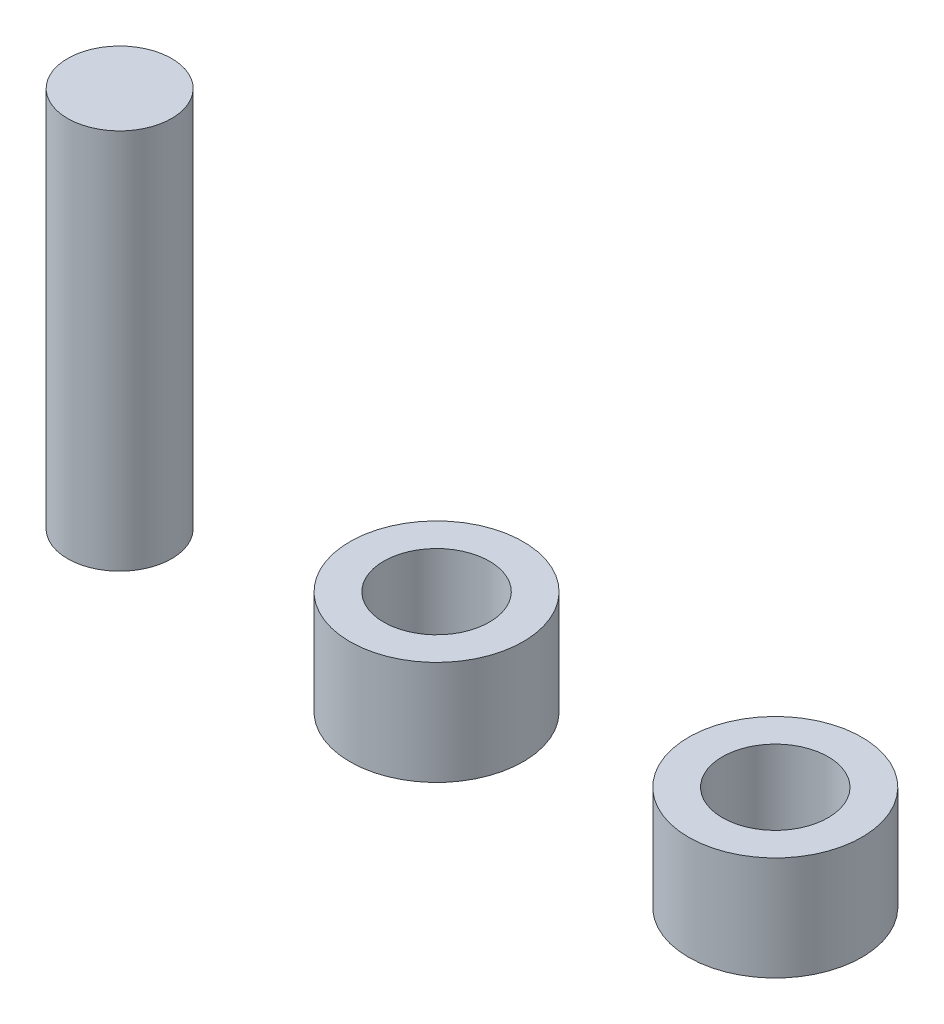
ISO-10303-21;
HEADER;
FILE_DESCRIPTION(('STEP AP214'),'2;1');
FILE_NAME('part.step','',(''),(''),'','','');
FILE_SCHEMA(('AUTOMOTIVE_DESIGN { 1 0 10303 214 1 1 1 1 }'));
ENDSEC;
DATA;
#1=APPLICATION_CONTEXT('core data for automotive mechanical design processes');
#2=APPLICATION_PROTOCOL_DEFINITION('international standard','automotive_design',2000,#1);
#3=PRODUCT_CONTEXT('',#1,'mechanical');
#4=PRODUCT('Part','Part','',(#3));
#5=PRODUCT_RELATED_PRODUCT_CATEGORY('part','',(#4));
#6=PRODUCT_DEFINITION_FORMATION('','',#4);
#7=PRODUCT_DEFINITION_CONTEXT('part definition',#1,'design');
#8=PRODUCT_DEFINITION('design','',#6,#7);
#9=PRODUCT_DEFINITION_SHAPE('','',#8);
#10=(LENGTH_UNIT() NAMED_UNIT(*) SI_UNIT(.MILLI.,.METRE.));
#11=(NAMED_UNIT(*) PLANE_ANGLE_UNIT() SI_UNIT($,.RADIAN.));
#12=(NAMED_UNIT(*) SI_UNIT($,.STERADIAN.) SOLID_ANGLE_UNIT());
#13=UNCERTAINTY_MEASURE_WITH_UNIT(LENGTH_MEASURE(1.E-05),#10,'distance_accuracy_value','');
#14=(GEOMETRIC_REPRESENTATION_CONTEXT(3) GLOBAL_UNCERTAINTY_ASSIGNED_CONTEXT((#13)) GLOBAL_UNIT_ASSIGNED_CONTEXT((#10,
#11,#12)) REPRESENTATION_CONTEXT('',''));
#15=CARTESIAN_POINT('',(0.,0.,0.));
#16=DIRECTION('',(0.,0.,1.));
#17=DIRECTION('',(1.,0.,0.));
#18=AXIS2_PLACEMENT_3D('',#15,#16,#17);
#19=CARTESIAN_POINT('',(9.88541352372916,3.,0.));
#20=DIRECTION('',(0.,1.,0.));
#21=DIRECTION('',(0.,0.,1.));
#22=AXIS2_PLACEMENT_3D('',#19,#20,#21);
#23=PLANE('',#22);
#24=CARTESIAN_POINT('',(9.88541352372916,3.,0.));
#25=DIRECTION('',(0.,-1.,0.));
#26=DIRECTION('',(0.,0.,1.));
#27=AXIS2_PLACEMENT_3D('',#24,#25,#26);
#28=CIRCLE('',#27,2.5);
#29=CARTESIAN_POINT('',(9.88541352372916,3.,2.5));
#30=VERTEX_POINT('',#29);
#31=EDGE_CURVE('E11',#30,#30,#28,.T.);
#32=ORIENTED_EDGE('',*,*,#31,.F.);
#33=EDGE_LOOP('',(#32));
#34=FACE_BOUND('',#33,.T.);
#35=CARTESIAN_POINT('',(9.88541352372916,3.,0.));
#36=DIRECTION('',(0.,-1.,0.));
#37=DIRECTION('',(0.,0.,1.));
#38=AXIS2_PLACEMENT_3D('',#35,#36,#37);
#39=CIRCLE('',#38,1.525);
#40=CARTESIAN_POINT('',(9.88541352372916,3.,1.525));
#41=VERTEX_POINT('',#40);
#42=EDGE_CURVE('E51',#41,#41,#39,.T.);
#43=ORIENTED_EDGE('',*,*,#42,.T.);
#44=EDGE_LOOP('',(#43));
#45=FACE_BOUND('',#44,.T.);
#46=ADVANCED_FACE('F40',(#34,#45),#23,.T.);
#47=CARTESIAN_POINT('',(9.88541352372916,0.,0.));
#48=DIRECTION('',(0.,1.,0.));
#49=DIRECTION('',(0.,0.,1.));
#50=AXIS2_PLACEMENT_3D('',#47,#48,#49);
#51=PLANE('',#50);
#52=CARTESIAN_POINT('',(9.88541352372916,0.,0.));
#53=DIRECTION('',(0.,-1.,0.));
#54=DIRECTION('',(0.,0.,1.));
#55=AXIS2_PLACEMENT_3D('',#52,#53,#54);
#56=CIRCLE('',#55,2.5);
#57=CARTESIAN_POINT('',(9.88541352372916,0.,2.5));
#58=VERTEX_POINT('',#57);
#59=EDGE_CURVE('E44',#58,#58,#56,.T.);
#60=ORIENTED_EDGE('',*,*,#59,.T.);
#61=EDGE_LOOP('',(#60));
#62=FACE_BOUND('',#61,.T.);
#63=CARTESIAN_POINT('',(9.88541352372916,0.,0.));
#64=DIRECTION('',(0.,-1.,0.));
#65=DIRECTION('',(0.,0.,1.));
#66=AXIS2_PLACEMENT_3D('',#63,#64,#65);
#67=CIRCLE('',#66,1.525);
#68=CARTESIAN_POINT('',(9.88541352372916,0.,1.525));
#69=VERTEX_POINT('',#68);
#70=EDGE_CURVE('E53',#69,#69,#67,.T.);
#71=ORIENTED_EDGE('',*,*,#70,.F.);
#72=EDGE_LOOP('',(#71));
#73=FACE_BOUND('',#72,.T.);
#74=ADVANCED_FACE('F66',(#62,#73),#51,.F.);
#75=CARTESIAN_POINT('',(9.88541352372916,3.,0.));
#76=DIRECTION('',(0.,-1.,0.));
#77=DIRECTION('',(0.,0.,-1.));
#78=AXIS2_PLACEMENT_3D('',#75,#76,#77);
#79=CYLINDRICAL_SURFACE('',#78,2.5);
#80=ORIENTED_EDGE('',*,*,#31,.T.);
#81=EDGE_LOOP('',(#80));
#82=FACE_BOUND('',#81,.T.);
#83=ORIENTED_EDGE('',*,*,#59,.F.);
#84=EDGE_LOOP('',(#83));
#85=FACE_BOUND('',#84,.T.);
#86=ADVANCED_FACE('F42',(#82,#85),#79,.T.);
#87=CARTESIAN_POINT('',(9.88541352372916,3.,0.));
#88=DIRECTION('',(0.,-1.,0.));
#89=DIRECTION('',(0.,0.,-1.));
#90=AXIS2_PLACEMENT_3D('',#87,#88,#89);
#91=CYLINDRICAL_SURFACE('',#90,1.525);
#92=ORIENTED_EDGE('',*,*,#42,.F.);
#93=EDGE_LOOP('',(#92));
#94=FACE_BOUND('',#93,.T.);
#95=ORIENTED_EDGE('',*,*,#70,.T.);
#96=EDGE_LOOP('',(#95));
#97=FACE_BOUND('',#96,.T.);
#98=ADVANCED_FACE('F60',(#94,#97),#91,.F.);
#99=CLOSED_SHELL('',(#46,#74,#86,#98));
#100=MANIFOLD_SOLID_BREP('B2',#99);
#101=CARTESIAN_POINT('',(-9.0272965862901,11.,0.));
#102=DIRECTION('',(0.,-1.,0.));
#103=DIRECTION('',(0.,0.,-1.));
#104=AXIS2_PLACEMENT_3D('',#101,#102,#103);
#105=CYLINDRICAL_SURFACE('',#104,1.5);
#106=CARTESIAN_POINT('',(-9.0272965862901,11.,0.));
#107=DIRECTION('',(0.,1.,0.));
#108=DIRECTION('',(0.,0.,1.));
#109=AXIS2_PLACEMENT_3D('',#106,#107,#108);
#110=CIRCLE('',#109,1.5);
#111=CARTESIAN_POINT('',(-9.0272965862901,11.,1.5));
#112=VERTEX_POINT('',#111);
#113=EDGE_CURVE('E39',#112,#112,#110,.T.);
#114=ORIENTED_EDGE('',*,*,#113,.F.);
#115=EDGE_LOOP('',(#114));
#116=FACE_BOUND('',#115,.T.);
#117=CARTESIAN_POINT('',(-9.0272965862901,0.,0.));
#118=DIRECTION('',(0.,1.,0.));
#119=DIRECTION('',(0.,0.,1.));
#120=AXIS2_PLACEMENT_3D('',#117,#118,#119);
#121=CIRCLE('',#120,1.5);
#122=CARTESIAN_POINT('',(-9.0272965862901,0.,1.5));
#123=VERTEX_POINT('',#122);
#124=EDGE_CURVE('E112',#123,#123,#121,.T.);
#125=ORIENTED_EDGE('',*,*,#124,.T.);
#126=EDGE_LOOP('',(#125));
#127=FACE_BOUND('',#126,.T.);
#128=ADVANCED_FACE('F109',(#116,#127),#105,.T.);
#129=CARTESIAN_POINT('',(-9.0272965862901,11.,0.));
#130=DIRECTION('',(0.,1.,0.));
#131=DIRECTION('',(0.,0.,1.));
#132=AXIS2_PLACEMENT_3D('',#129,#130,#131);
#133=PLANE('',#132);
#134=ORIENTED_EDGE('',*,*,#113,.T.);
#135=EDGE_LOOP('',(#134));
#136=FACE_BOUND('',#135,.T.);
#137=ADVANCED_FACE('F124',(#136),#133,.T.);
#138=CARTESIAN_POINT('',(-9.0272965862901,0.,0.));
#139=DIRECTION('',(0.,1.,0.));
#140=DIRECTION('',(0.,0.,1.));
#141=AXIS2_PLACEMENT_3D('',#138,#139,#140);
#142=PLANE('',#141);
#143=ORIENTED_EDGE('',*,*,#124,.F.);
#144=EDGE_LOOP('',(#143));
#145=FACE_BOUND('',#144,.T.);
#146=ADVANCED_FACE('F122',(#145),#142,.F.);
#147=CLOSED_SHELL('',(#128,#137,#146));
#148=MANIFOLD_SOLID_BREP('B6',#147);
#149=CARTESIAN_POINT('',(0.11458647627084,3.,0.));
#150=DIRECTION('',(0.,1.,0.));
#151=DIRECTION('',(0.,0.,1.));
#152=AXIS2_PLACEMENT_3D('',#149,#150,#151);
#153=PLANE('',#152);
#154=CARTESIAN_POINT('',(0.11458647627084,3.,0.));
#155=DIRECTION('',(0.,1.,0.));
#156=DIRECTION('',(0.,0.,1.));
#157=AXIS2_PLACEMENT_3D('',#154,#155,#156);
#158=CIRCLE('',#157,2.5);
#159=CARTESIAN_POINT('',(0.11458647627084,3.,2.5));
#160=VERTEX_POINT('',#159);
#161=EDGE_CURVE('E108',#160,#160,#158,.T.);
#162=ORIENTED_EDGE('',*,*,#161,.T.);
#163=EDGE_LOOP('',(#162));
#164=FACE_BOUND('',#163,.T.);
#165=CARTESIAN_POINT('',(0.11458647627084,3.,0.));
#166=DIRECTION('',(0.,1.,0.));
#167=DIRECTION('',(0.,0.,1.));
#168=AXIS2_PLACEMENT_3D('',#165,#166,#167);
#169=CIRCLE('',#168,1.525);
#170=CARTESIAN_POINT('',(0.11458647627084,3.,1.525));
#171=VERTEX_POINT('',#170);
#172=EDGE_CURVE('E161',#171,#171,#169,.T.);
#173=ORIENTED_EDGE('',*,*,#172,.F.);
#174=EDGE_LOOP('',(#173));
#175=FACE_BOUND('',#174,.T.);
#176=ADVANCED_FACE('F150',(#164,#175),#153,.T.);
#177=CARTESIAN_POINT('',(0.11458647627084,0.,0.));
#178=DIRECTION('',(0.,1.,0.));
#179=DIRECTION('',(0.,0.,1.));
#180=AXIS2_PLACEMENT_3D('',#177,#178,#179);
#181=PLANE('',#180);
#182=CARTESIAN_POINT('',(0.11458647627084,0.,0.));
#183=DIRECTION('',(0.,1.,0.));
#184=DIRECTION('',(0.,0.,1.));
#185=AXIS2_PLACEMENT_3D('',#182,#183,#184);
#186=CIRCLE('',#185,2.5);
#187=CARTESIAN_POINT('',(0.11458647627084,0.,2.5));
#188=VERTEX_POINT('',#187);
#189=EDGE_CURVE('E154',#188,#188,#186,.T.);
#190=ORIENTED_EDGE('',*,*,#189,.F.);
#191=EDGE_LOOP('',(#190));
#192=FACE_BOUND('',#191,.T.);
#193=CARTESIAN_POINT('',(0.11458647627084,0.,0.));
#194=DIRECTION('',(0.,1.,0.));
#195=DIRECTION('',(0.,0.,1.));
#196=AXIS2_PLACEMENT_3D('',#193,#194,#195);
#197=CIRCLE('',#196,1.525);
#198=CARTESIAN_POINT('',(0.11458647627084,0.,1.525));
#199=VERTEX_POINT('',#198);
#200=EDGE_CURVE('E163',#199,#199,#197,.T.);
#201=ORIENTED_EDGE('',*,*,#200,.T.);
#202=EDGE_LOOP('',(#201));
#203=FACE_BOUND('',#202,.T.);
#204=ADVANCED_FACE('F173',(#192,#203),#181,.F.);
#205=CARTESIAN_POINT('',(0.11458647627084,3.,0.));
#206=DIRECTION('',(0.,-1.,0.));
#207=DIRECTION('',(0.,0.,-1.));
#208=AXIS2_PLACEMENT_3D('',#205,#206,#207);
#209=CYLINDRICAL_SURFACE('',#208,2.5);
#210=ORIENTED_EDGE('',*,*,#161,.F.);
#211=EDGE_LOOP('',(#210));
#212=FACE_BOUND('',#211,.T.);
#213=ORIENTED_EDGE('',*,*,#189,.T.);
#214=EDGE_LOOP('',(#213));
#215=FACE_BOUND('',#214,.T.);
#216=ADVANCED_FACE('F152',(#212,#215),#209,.T.);
#217=CARTESIAN_POINT('',(0.11458647627084,3.,0.));
#218=DIRECTION('',(0.,-1.,0.));
#219=DIRECTION('',(0.,0.,-1.));
#220=AXIS2_PLACEMENT_3D('',#217,#218,#219);
#221=CYLINDRICAL_SURFACE('',#220,1.525);
#222=ORIENTED_EDGE('',*,*,#172,.T.);
#223=EDGE_LOOP('',(#222));
#224=FACE_BOUND('',#223,.T.);
#225=ORIENTED_EDGE('',*,*,#200,.F.);
#226=EDGE_LOOP('',(#225));
#227=FACE_BOUND('',#226,.T.);
#228=ADVANCED_FACE('F169',(#224,#227),#221,.F.);
#229=CLOSED_SHELL('',(#176,#204,#216,#228));
#230=MANIFOLD_SOLID_BREP('B34',#229);
#231=ADVANCED_BREP_SHAPE_REPRESENTATION('',(#18,#100,#148,#230),#14);
#232=SHAPE_DEFINITION_REPRESENTATION(#9,#231);
ENDSEC;
END-ISO-10303-21;
